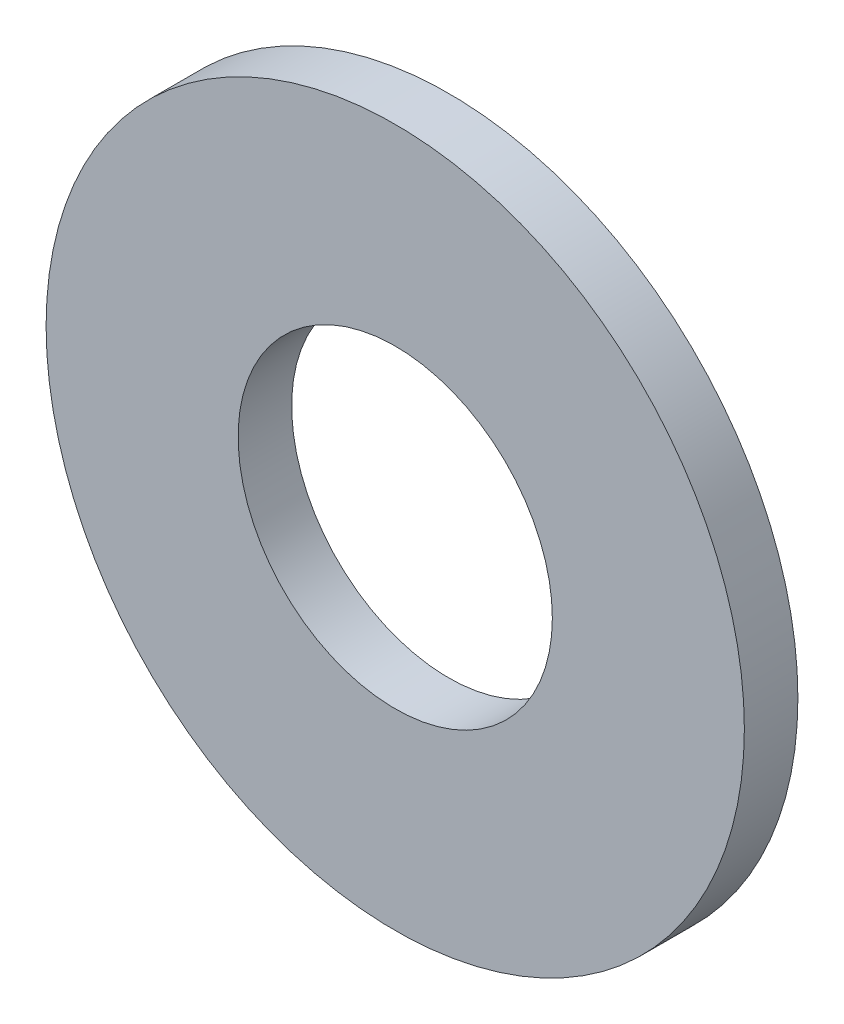
ISO-10303-21;
HEADER;
FILE_DESCRIPTION(('STEP AP214'),'2;1');
FILE_NAME('part.step','',(''),(''),'','','');
FILE_SCHEMA(('AUTOMOTIVE_DESIGN { 1 0 10303 214 1 1 1 1 }'));
ENDSEC;
DATA;
#1=APPLICATION_CONTEXT('core data for automotive mechanical design processes');
#2=APPLICATION_PROTOCOL_DEFINITION('international standard','automotive_design',2000,#1);
#3=PRODUCT_CONTEXT('',#1,'mechanical');
#4=PRODUCT('Part','Part','',(#3));
#5=PRODUCT_RELATED_PRODUCT_CATEGORY('part','',(#4));
#6=PRODUCT_DEFINITION_FORMATION('','',#4);
#7=PRODUCT_DEFINITION_CONTEXT('part definition',#1,'design');
#8=PRODUCT_DEFINITION('design','',#6,#7);
#9=PRODUCT_DEFINITION_SHAPE('','',#8);
#10=(LENGTH_UNIT() NAMED_UNIT(*) SI_UNIT(.MILLI.,.METRE.));
#11=(NAMED_UNIT(*) PLANE_ANGLE_UNIT() SI_UNIT($,.RADIAN.));
#12=(NAMED_UNIT(*) SI_UNIT($,.STERADIAN.) SOLID_ANGLE_UNIT());
#13=UNCERTAINTY_MEASURE_WITH_UNIT(LENGTH_MEASURE(1.E-05),#10,'distance_accuracy_value','');
#14=(GEOMETRIC_REPRESENTATION_CONTEXT(3) GLOBAL_UNCERTAINTY_ASSIGNED_CONTEXT((#13)) GLOBAL_UNIT_ASSIGNED_CONTEXT((#10,
#11,#12)) REPRESENTATION_CONTEXT('',''));
#15=CARTESIAN_POINT('',(0.,0.,0.));
#16=DIRECTION('',(0.,0.,1.));
#17=DIRECTION('',(1.,0.,0.));
#18=AXIS2_PLACEMENT_3D('',#15,#16,#17);
#19=CARTESIAN_POINT('',(0.,0.,1.15));
#20=DIRECTION('',(0.,0.,1.));
#21=DIRECTION('',(1.,0.,0.));
#22=AXIS2_PLACEMENT_3D('',#19,#20,#21);
#23=PLANE('',#22);
#24=CARTESIAN_POINT('',(0.,0.,1.15));
#25=DIRECTION('',(0.,0.,1.));
#26=DIRECTION('',(1.,0.,0.));
#27=AXIS2_PLACEMENT_3D('',#24,#25,#26);
#28=CIRCLE('',#27,15.);
#29=CARTESIAN_POINT('',(15.,0.,1.15));
#30=VERTEX_POINT('',#29);
#31=EDGE_CURVE('E10',#30,#30,#28,.T.);
#32=ORIENTED_EDGE('',*,*,#31,.T.);
#33=EDGE_LOOP('',(#32));
#34=FACE_BOUND('',#33,.T.);
#35=CARTESIAN_POINT('',(0.,0.,1.15));
#36=DIRECTION('',(0.,0.,1.));
#37=DIRECTION('',(1.,0.,0.));
#38=AXIS2_PLACEMENT_3D('',#35,#36,#37);
#39=CIRCLE('',#38,6.75);
#40=CARTESIAN_POINT('',(6.75,0.,1.15));
#41=VERTEX_POINT('',#40);
#42=EDGE_CURVE('E39',#41,#41,#39,.T.);
#43=ORIENTED_EDGE('',*,*,#42,.F.);
#44=EDGE_LOOP('',(#43));
#45=FACE_BOUND('',#44,.T.);
#46=ADVANCED_FACE('F28',(#34,#45),#23,.T.);
#47=CARTESIAN_POINT('',(0.,0.,-1.15));
#48=DIRECTION('',(0.,0.,1.));
#49=DIRECTION('',(1.,0.,0.));
#50=AXIS2_PLACEMENT_3D('',#47,#48,#49);
#51=PLANE('',#50);
#52=CARTESIAN_POINT('',(0.,0.,-1.15));
#53=DIRECTION('',(0.,0.,1.));
#54=DIRECTION('',(1.,0.,0.));
#55=AXIS2_PLACEMENT_3D('',#52,#53,#54);
#56=CIRCLE('',#55,15.);
#57=CARTESIAN_POINT('',(15.,0.,-1.15));
#58=VERTEX_POINT('',#57);
#59=EDGE_CURVE('E32',#58,#58,#56,.T.);
#60=ORIENTED_EDGE('',*,*,#59,.F.);
#61=EDGE_LOOP('',(#60));
#62=FACE_BOUND('',#61,.T.);
#63=CARTESIAN_POINT('',(0.,0.,-1.15));
#64=DIRECTION('',(0.,0.,1.));
#65=DIRECTION('',(1.,0.,0.));
#66=AXIS2_PLACEMENT_3D('',#63,#64,#65);
#67=CIRCLE('',#66,6.75);
#68=CARTESIAN_POINT('',(6.75,0.,-1.15));
#69=VERTEX_POINT('',#68);
#70=EDGE_CURVE('E41',#69,#69,#67,.T.);
#71=ORIENTED_EDGE('',*,*,#70,.T.);
#72=EDGE_LOOP('',(#71));
#73=FACE_BOUND('',#72,.T.);
#74=ADVANCED_FACE('F51',(#62,#73),#51,.F.);
#75=CARTESIAN_POINT('',(0.,0.,1.15));
#76=DIRECTION('',(0.,0.,-1.));
#77=DIRECTION('',(-1.,0.,0.));
#78=AXIS2_PLACEMENT_3D('',#75,#76,#77);
#79=CYLINDRICAL_SURFACE('',#78,15.);
#80=ORIENTED_EDGE('',*,*,#31,.F.);
#81=EDGE_LOOP('',(#80));
#82=FACE_BOUND('',#81,.T.);
#83=ORIENTED_EDGE('',*,*,#59,.T.);
#84=EDGE_LOOP('',(#83));
#85=FACE_BOUND('',#84,.T.);
#86=ADVANCED_FACE('F30',(#82,#85),#79,.T.);
#87=CARTESIAN_POINT('',(0.,0.,1.15));
#88=DIRECTION('',(0.,0.,-1.));
#89=DIRECTION('',(-1.,0.,0.));
#90=AXIS2_PLACEMENT_3D('',#87,#88,#89);
#91=CYLINDRICAL_SURFACE('',#90,6.75);
#92=ORIENTED_EDGE('',*,*,#42,.T.);
#93=EDGE_LOOP('',(#92));
#94=FACE_BOUND('',#93,.T.);
#95=ORIENTED_EDGE('',*,*,#70,.F.);
#96=EDGE_LOOP('',(#95));
#97=FACE_BOUND('',#96,.T.);
#98=ADVANCED_FACE('F47',(#94,#97),#91,.F.);
#99=CLOSED_SHELL('',(#46,#74,#86,#98));
#100=MANIFOLD_SOLID_BREP('B2',#99);
#101=ADVANCED_BREP_SHAPE_REPRESENTATION('',(#18,#100),#14);
#102=SHAPE_DEFINITION_REPRESENTATION(#9,#101);
ENDSEC;
END-ISO-10303-21;
